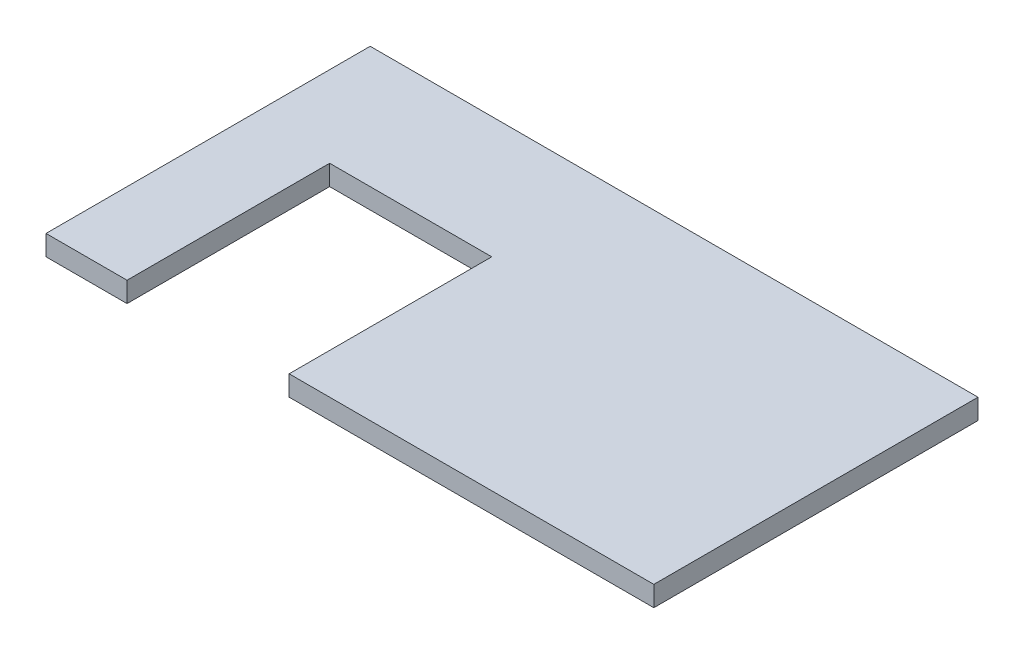
ISO-10303-21;
HEADER;
FILE_DESCRIPTION(('STEP AP214'),'2;1');
FILE_NAME('part.step','',(''),(''),'','','');
FILE_SCHEMA(('AUTOMOTIVE_DESIGN { 1 0 10303 214 1 1 1 1 }'));
ENDSEC;
DATA;
#1=APPLICATION_CONTEXT('core data for automotive mechanical design processes');
#2=APPLICATION_PROTOCOL_DEFINITION('international standard','automotive_design',2000,#1);
#3=PRODUCT_CONTEXT('',#1,'mechanical');
#4=PRODUCT('Part','Part','',(#3));
#5=PRODUCT_RELATED_PRODUCT_CATEGORY('part','',(#4));
#6=PRODUCT_DEFINITION_FORMATION('','',#4);
#7=PRODUCT_DEFINITION_CONTEXT('part definition',#1,'design');
#8=PRODUCT_DEFINITION('design','',#6,#7);
#9=PRODUCT_DEFINITION_SHAPE('','',#8);
#10=(LENGTH_UNIT() NAMED_UNIT(*) SI_UNIT(.MILLI.,.METRE.));
#11=(NAMED_UNIT(*) PLANE_ANGLE_UNIT() SI_UNIT($,.RADIAN.));
#12=(NAMED_UNIT(*) SI_UNIT($,.STERADIAN.) SOLID_ANGLE_UNIT());
#13=UNCERTAINTY_MEASURE_WITH_UNIT(LENGTH_MEASURE(1.E-05),#10,'distance_accuracy_value','');
#14=(GEOMETRIC_REPRESENTATION_CONTEXT(3) GLOBAL_UNCERTAINTY_ASSIGNED_CONTEXT((#13)) GLOBAL_UNIT_ASSIGNED_CONTEXT((#10,
#11,#12)) REPRESENTATION_CONTEXT('',''));
#15=CARTESIAN_POINT('',(0.,0.,0.));
#16=DIRECTION('',(0.,0.,1.));
#17=DIRECTION('',(1.,0.,0.));
#18=AXIS2_PLACEMENT_3D('',#15,#16,#17);
#19=CARTESIAN_POINT('',(75.,5.,40.));
#20=DIRECTION('',(-1.,0.,0.));
#21=DIRECTION('',(0.,0.,1.));
#22=AXIS2_PLACEMENT_3D('',#19,#20,#21);
#23=PLANE('',#22);
#24=DIRECTION('',(0.,0.,-1.));
#25=VECTOR('',#24,1.);
#26=CARTESIAN_POINT('',(75.,0.,40.));
#27=LINE('',#26,#25);
#28=CARTESIAN_POINT('',(75.,0.,40.));
#29=VERTEX_POINT('',#28);
#30=CARTESIAN_POINT('',(75.,0.,-40.));
#31=VERTEX_POINT('',#30);
#32=EDGE_CURVE('E144',#29,#31,#27,.T.);
#33=ORIENTED_EDGE('',*,*,#32,.T.);
#34=DIRECTION('',(0.,-1.,0.));
#35=VECTOR('',#34,1.);
#36=CARTESIAN_POINT('',(75.,5.,-40.));
#37=LINE('',#36,#35);
#38=CARTESIAN_POINT('',(75.,5.,-40.));
#39=VERTEX_POINT('',#38);
#40=EDGE_CURVE('E11',#39,#31,#37,.T.);
#41=ORIENTED_EDGE('',*,*,#40,.F.);
#42=DIRECTION('',(0.,0.,-1.));
#43=VECTOR('',#42,1.);
#44=CARTESIAN_POINT('',(75.,5.,40.));
#45=LINE('',#44,#43);
#46=CARTESIAN_POINT('',(75.,5.,40.));
#47=VERTEX_POINT('',#46);
#48=EDGE_CURVE('E166',#47,#39,#45,.T.);
#49=ORIENTED_EDGE('',*,*,#48,.F.);
#50=DIRECTION('',(0.,-1.,0.));
#51=VECTOR('',#50,1.);
#52=CARTESIAN_POINT('',(75.,5.,40.));
#53=LINE('',#52,#51);
#54=EDGE_CURVE('E140',#47,#29,#53,.T.);
#55=ORIENTED_EDGE('',*,*,#54,.T.);
#56=EDGE_LOOP('',(#33,#41,#49,#55));
#57=FACE_BOUND('',#56,.T.);
#58=ADVANCED_FACE('F43',(#57),#23,.F.);
#59=CARTESIAN_POINT('',(-75.,5.,-40.));
#60=DIRECTION('',(0.,0.,1.));
#61=DIRECTION('',(1.,0.,0.));
#62=AXIS2_PLACEMENT_3D('',#59,#60,#61);
#63=PLANE('',#62);
#64=DIRECTION('',(-1.,0.,0.));
#65=VECTOR('',#64,1.);
#66=CARTESIAN_POINT('',(-75.,0.,-40.));
#67=LINE('',#66,#65);
#68=CARTESIAN_POINT('',(-75.,0.,-40.));
#69=VERTEX_POINT('',#68);
#70=EDGE_CURVE('E148',#31,#69,#67,.T.);
#71=ORIENTED_EDGE('',*,*,#70,.T.);
#72=DIRECTION('',(0.,-1.,0.));
#73=VECTOR('',#72,1.);
#74=CARTESIAN_POINT('',(-75.,5.,-40.));
#75=LINE('',#74,#73);
#76=CARTESIAN_POINT('',(-75.,5.,-40.));
#77=VERTEX_POINT('',#76);
#78=EDGE_CURVE('E52',#77,#69,#75,.T.);
#79=ORIENTED_EDGE('',*,*,#78,.F.);
#80=DIRECTION('',(-1.,0.,0.));
#81=VECTOR('',#80,1.);
#82=CARTESIAN_POINT('',(-75.,5.,-40.));
#83=LINE('',#82,#81);
#84=EDGE_CURVE('E103',#39,#77,#83,.T.);
#85=ORIENTED_EDGE('',*,*,#84,.F.);
#86=ORIENTED_EDGE('',*,*,#40,.T.);
#87=EDGE_LOOP('',(#71,#79,#85,#86));
#88=FACE_BOUND('',#87,.T.);
#89=ADVANCED_FACE('F212',(#88),#63,.F.);
#90=CARTESIAN_POINT('',(-75.,5.,40.));
#91=DIRECTION('',(1.,0.,0.));
#92=DIRECTION('',(0.,0.,-1.));
#93=AXIS2_PLACEMENT_3D('',#90,#91,#92);
#94=PLANE('',#93);
#95=DIRECTION('',(0.,0.,1.));
#96=VECTOR('',#95,1.);
#97=CARTESIAN_POINT('',(-75.,0.,40.));
#98=LINE('',#97,#96);
#99=CARTESIAN_POINT('',(-75.,0.,40.));
#100=VERTEX_POINT('',#99);
#101=EDGE_CURVE('E151',#69,#100,#98,.T.);
#102=ORIENTED_EDGE('',*,*,#101,.T.);
#103=DIRECTION('',(0.,-1.,0.));
#104=VECTOR('',#103,1.);
#105=CARTESIAN_POINT('',(-75.,5.,40.));
#106=LINE('',#105,#104);
#107=CARTESIAN_POINT('',(-75.,5.,40.));
#108=VERTEX_POINT('',#107);
#109=EDGE_CURVE('E177',#108,#100,#106,.T.);
#110=ORIENTED_EDGE('',*,*,#109,.F.);
#111=DIRECTION('',(0.,0.,1.));
#112=VECTOR('',#111,1.);
#113=CARTESIAN_POINT('',(-75.,5.,40.));
#114=LINE('',#113,#112);
#115=EDGE_CURVE('E187',#77,#108,#114,.T.);
#116=ORIENTED_EDGE('',*,*,#115,.F.);
#117=ORIENTED_EDGE('',*,*,#78,.T.);
#118=EDGE_LOOP('',(#102,#110,#116,#117));
#119=FACE_BOUND('',#118,.T.);
#120=ADVANCED_FACE('F185',(#119),#94,.F.);
#121=CARTESIAN_POINT('',(-75.,5.,40.));
#122=DIRECTION('',(0.,0.,-1.));
#123=DIRECTION('',(-1.,0.,0.));
#124=AXIS2_PLACEMENT_3D('',#121,#122,#123);
#125=PLANE('',#124);
#126=DIRECTION('',(1.,0.,0.));
#127=VECTOR('',#126,1.);
#128=CARTESIAN_POINT('',(-75.,0.,40.));
#129=LINE('',#128,#127);
#130=CARTESIAN_POINT('',(-55.,0.,40.));
#131=VERTEX_POINT('',#130);
#132=EDGE_CURVE('E154',#100,#131,#129,.T.);
#133=ORIENTED_EDGE('',*,*,#132,.T.);
#134=DIRECTION('',(0.,-1.,0.));
#135=VECTOR('',#134,1.);
#136=CARTESIAN_POINT('',(-55.,5.,40.));
#137=LINE('',#136,#135);
#138=CARTESIAN_POINT('',(-55.,5.,40.));
#139=VERTEX_POINT('',#138);
#140=EDGE_CURVE('E173',#139,#131,#137,.T.);
#141=ORIENTED_EDGE('',*,*,#140,.F.);
#142=DIRECTION('',(1.,0.,0.));
#143=VECTOR('',#142,1.);
#144=CARTESIAN_POINT('',(-75.,5.,40.));
#145=LINE('',#144,#143);
#146=EDGE_CURVE('E200',#108,#139,#145,.T.);
#147=ORIENTED_EDGE('',*,*,#146,.F.);
#148=ORIENTED_EDGE('',*,*,#109,.T.);
#149=EDGE_LOOP('',(#133,#141,#147,#148));
#150=FACE_BOUND('',#149,.T.);
#151=ADVANCED_FACE('F195',(#150),#125,.F.);
#152=CARTESIAN_POINT('',(-55.,5.,40.));
#153=DIRECTION('',(-1.,0.,0.));
#154=DIRECTION('',(0.,0.,1.));
#155=AXIS2_PLACEMENT_3D('',#152,#153,#154);
#156=PLANE('',#155);
#157=DIRECTION('',(0.,0.,-1.));
#158=VECTOR('',#157,1.);
#159=CARTESIAN_POINT('',(-55.,0.,40.));
#160=LINE('',#159,#158);
#161=CARTESIAN_POINT('',(-55.,0.,-10.));
#162=VERTEX_POINT('',#161);
#163=EDGE_CURVE('E157',#131,#162,#160,.T.);
#164=ORIENTED_EDGE('',*,*,#163,.T.);
#165=DIRECTION('',(0.,-1.,0.));
#166=VECTOR('',#165,1.);
#167=CARTESIAN_POINT('',(-55.,5.,-10.));
#168=LINE('',#167,#166);
#169=CARTESIAN_POINT('',(-55.,5.,-10.));
#170=VERTEX_POINT('',#169);
#171=EDGE_CURVE('E133',#170,#162,#168,.T.);
#172=ORIENTED_EDGE('',*,*,#171,.F.);
#173=DIRECTION('',(0.,0.,-1.));
#174=VECTOR('',#173,1.);
#175=CARTESIAN_POINT('',(-55.,5.,40.));
#176=LINE('',#175,#174);
#177=EDGE_CURVE('E122',#139,#170,#176,.T.);
#178=ORIENTED_EDGE('',*,*,#177,.F.);
#179=ORIENTED_EDGE('',*,*,#140,.T.);
#180=EDGE_LOOP('',(#164,#172,#178,#179));
#181=FACE_BOUND('',#180,.T.);
#182=ADVANCED_FACE('F198',(#181),#156,.F.);
#183=CARTESIAN_POINT('',(-55.,5.,-10.));
#184=DIRECTION('',(0.,0.,-1.));
#185=DIRECTION('',(-1.,0.,0.));
#186=AXIS2_PLACEMENT_3D('',#183,#184,#185);
#187=PLANE('',#186);
#188=DIRECTION('',(1.,0.,0.));
#189=VECTOR('',#188,1.);
#190=CARTESIAN_POINT('',(-55.,0.,-10.));
#191=LINE('',#190,#189);
#192=CARTESIAN_POINT('',(-15.,0.,-10.));
#193=VERTEX_POINT('',#192);
#194=EDGE_CURVE('E131',#162,#193,#191,.T.);
#195=ORIENTED_EDGE('',*,*,#194,.T.);
#196=DIRECTION('',(0.,-1.,0.));
#197=VECTOR('',#196,1.);
#198=CARTESIAN_POINT('',(-15.,5.,-10.));
#199=LINE('',#198,#197);
#200=CARTESIAN_POINT('',(-15.,5.,-10.));
#201=VERTEX_POINT('',#200);
#202=EDGE_CURVE('E128',#201,#193,#199,.T.);
#203=ORIENTED_EDGE('',*,*,#202,.F.);
#204=DIRECTION('',(1.,0.,0.));
#205=VECTOR('',#204,1.);
#206=CARTESIAN_POINT('',(-55.,5.,-10.));
#207=LINE('',#206,#205);
#208=EDGE_CURVE('E116',#170,#201,#207,.T.);
#209=ORIENTED_EDGE('',*,*,#208,.F.);
#210=ORIENTED_EDGE('',*,*,#171,.T.);
#211=EDGE_LOOP('',(#195,#203,#209,#210));
#212=FACE_BOUND('',#211,.T.);
#213=ADVANCED_FACE('F129',(#212),#187,.F.);
#214=CARTESIAN_POINT('',(-15.,5.,40.));
#215=DIRECTION('',(1.,0.,0.));
#216=DIRECTION('',(0.,0.,-1.));
#217=AXIS2_PLACEMENT_3D('',#214,#215,#216);
#218=PLANE('',#217);
#219=DIRECTION('',(0.,0.,1.));
#220=VECTOR('',#219,1.);
#221=CARTESIAN_POINT('',(-15.,0.,40.));
#222=LINE('',#221,#220);
#223=CARTESIAN_POINT('',(-15.,0.,40.));
#224=VERTEX_POINT('',#223);
#225=EDGE_CURVE('E89',#193,#224,#222,.T.);
#226=ORIENTED_EDGE('',*,*,#225,.T.);
#227=DIRECTION('',(0.,-1.,0.));
#228=VECTOR('',#227,1.);
#229=CARTESIAN_POINT('',(-15.,5.,40.));
#230=LINE('',#229,#228);
#231=CARTESIAN_POINT('',(-15.,5.,40.));
#232=VERTEX_POINT('',#231);
#233=EDGE_CURVE('E134',#232,#224,#230,.T.);
#234=ORIENTED_EDGE('',*,*,#233,.F.);
#235=DIRECTION('',(0.,0.,1.));
#236=VECTOR('',#235,1.);
#237=CARTESIAN_POINT('',(-15.,5.,40.));
#238=LINE('',#237,#236);
#239=EDGE_CURVE('E120',#201,#232,#238,.T.);
#240=ORIENTED_EDGE('',*,*,#239,.F.);
#241=ORIENTED_EDGE('',*,*,#202,.T.);
#242=EDGE_LOOP('',(#226,#234,#240,#241));
#243=FACE_BOUND('',#242,.T.);
#244=ADVANCED_FACE('F136',(#243),#218,.F.);
#245=CARTESIAN_POINT('',(-15.,5.,40.));
#246=DIRECTION('',(0.,0.,-1.));
#247=DIRECTION('',(-1.,0.,0.));
#248=AXIS2_PLACEMENT_3D('',#245,#246,#247);
#249=PLANE('',#248);
#250=DIRECTION('',(1.,0.,0.));
#251=VECTOR('',#250,1.);
#252=CARTESIAN_POINT('',(-15.,0.,40.));
#253=LINE('',#252,#251);
#254=EDGE_CURVE('E95',#224,#29,#253,.T.);
#255=ORIENTED_EDGE('',*,*,#254,.T.);
#256=ORIENTED_EDGE('',*,*,#54,.F.);
#257=DIRECTION('',(1.,0.,0.));
#258=VECTOR('',#257,1.);
#259=CARTESIAN_POINT('',(-15.,5.,40.));
#260=LINE('',#259,#258);
#261=EDGE_CURVE('E60',#232,#47,#260,.T.);
#262=ORIENTED_EDGE('',*,*,#261,.F.);
#263=ORIENTED_EDGE('',*,*,#233,.T.);
#264=EDGE_LOOP('',(#255,#256,#262,#263));
#265=FACE_BOUND('',#264,.T.);
#266=ADVANCED_FACE('F228',(#265),#249,.F.);
#267=CARTESIAN_POINT('',(0.,5.,0.));
#268=DIRECTION('',(0.,-1.,0.));
#269=DIRECTION('',(0.,0.,-1.));
#270=AXIS2_PLACEMENT_3D('',#267,#268,#269);
#271=PLANE('',#270);
#272=ORIENTED_EDGE('',*,*,#48,.T.);
#273=ORIENTED_EDGE('',*,*,#84,.T.);
#274=ORIENTED_EDGE('',*,*,#115,.T.);
#275=ORIENTED_EDGE('',*,*,#146,.T.);
#276=ORIENTED_EDGE('',*,*,#177,.T.);
#277=ORIENTED_EDGE('',*,*,#208,.T.);
#278=ORIENTED_EDGE('',*,*,#239,.T.);
#279=ORIENTED_EDGE('',*,*,#261,.T.);
#280=EDGE_LOOP('',(#272,#273,#274,#275,#276,#277,#278,#279));
#281=FACE_BOUND('',#280,.T.);
#282=ADVANCED_FACE('F118',(#281),#271,.F.);
#283=CARTESIAN_POINT('',(0.,0.,0.));
#284=DIRECTION('',(0.,-1.,0.));
#285=DIRECTION('',(0.,0.,-1.));
#286=AXIS2_PLACEMENT_3D('',#283,#284,#285);
#287=PLANE('',#286);
#288=ORIENTED_EDGE('',*,*,#32,.F.);
#289=ORIENTED_EDGE('',*,*,#254,.F.);
#290=ORIENTED_EDGE('',*,*,#225,.F.);
#291=ORIENTED_EDGE('',*,*,#194,.F.);
#292=ORIENTED_EDGE('',*,*,#163,.F.);
#293=ORIENTED_EDGE('',*,*,#132,.F.);
#294=ORIENTED_EDGE('',*,*,#101,.F.);
#295=ORIENTED_EDGE('',*,*,#70,.F.);
#296=EDGE_LOOP('',(#288,#289,#290,#291,#292,#293,#294,#295));
#297=FACE_BOUND('',#296,.T.);
#298=ADVANCED_FACE('F191',(#297),#287,.T.);
#299=CLOSED_SHELL('',(#58,#89,#120,#151,#182,#213,#244,#266,#282,#298));
#300=MANIFOLD_SOLID_BREP('B2',#299);
#301=ADVANCED_BREP_SHAPE_REPRESENTATION('',(#18,#300),#14);
#302=SHAPE_DEFINITION_REPRESENTATION(#9,#301);
ENDSEC;
END-ISO-10303-21;
